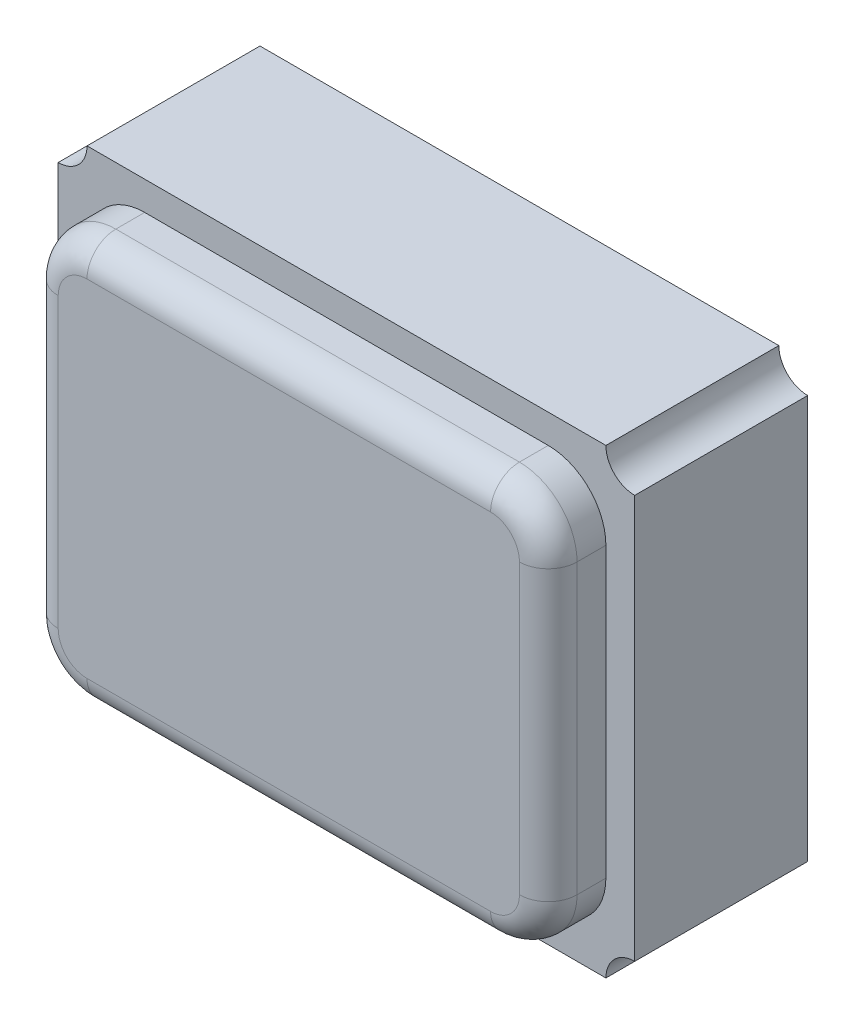
ISO-10303-21;
HEADER;
FILE_DESCRIPTION(('STEP AP214'),'2;1');
FILE_NAME('part.step','',(''),(''),'','','');
FILE_SCHEMA(('AUTOMOTIVE_DESIGN { 1 0 10303 214 1 1 1 1 }'));
ENDSEC;
DATA;
#1=APPLICATION_CONTEXT('core data for automotive mechanical design processes');
#2=APPLICATION_PROTOCOL_DEFINITION('international standard','automotive_design',2000,#1);
#3=PRODUCT_CONTEXT('',#1,'mechanical');
#4=PRODUCT('Part','Part','',(#3));
#5=PRODUCT_RELATED_PRODUCT_CATEGORY('part','',(#4));
#6=PRODUCT_DEFINITION_FORMATION('','',#4);
#7=PRODUCT_DEFINITION_CONTEXT('part definition',#1,'design');
#8=PRODUCT_DEFINITION('design','',#6,#7);
#9=PRODUCT_DEFINITION_SHAPE('','',#8);
#10=(LENGTH_UNIT() NAMED_UNIT(*) SI_UNIT(.MILLI.,.METRE.));
#11=(NAMED_UNIT(*) PLANE_ANGLE_UNIT() SI_UNIT($,.RADIAN.));
#12=(NAMED_UNIT(*) SI_UNIT($,.STERADIAN.) SOLID_ANGLE_UNIT());
#13=UNCERTAINTY_MEASURE_WITH_UNIT(LENGTH_MEASURE(1.E-05),#10,'distance_accuracy_value','');
#14=(GEOMETRIC_REPRESENTATION_CONTEXT(3) GLOBAL_UNCERTAINTY_ASSIGNED_CONTEXT((#13)) GLOBAL_UNIT_ASSIGNED_CONTEXT((#10,
#11,#12)) REPRESENTATION_CONTEXT('',''));
#15=CARTESIAN_POINT('',(0.,0.,0.));
#16=DIRECTION('',(0.,0.,1.));
#17=DIRECTION('',(1.,0.,0.));
#18=AXIS2_PLACEMENT_3D('',#15,#16,#17);
#19=CARTESIAN_POINT('',(3.,0.,3.227777777778));
#20=DIRECTION('',(0.,0.,1.));
#21=DIRECTION('',(1.,0.,0.));
#22=AXIS2_PLACEMENT_3D('',#19,#20,#21);
#23=PLANE('',#22);
#24=DIRECTION('',(0.,-1.,0.));
#25=VECTOR('',#24,1.);
#26=CARTESIAN_POINT('',(2.2,0.,3.227777777778));
#27=LINE('',#26,#25);
#28=CARTESIAN_POINT('',(2.2,-0.5,3.227777777778));
#29=VERTEX_POINT('',#28);
#30=CARTESIAN_POINT('',(2.2,0.5,3.227777777778));
#31=VERTEX_POINT('',#30);
#32=EDGE_CURVE('E178',#29,#31,#27,.F.);
#33=ORIENTED_EDGE('',*,*,#32,.F.);
#34=CARTESIAN_POINT('',(2.3,-0.5,3.227777777778));
#35=DIRECTION('',(0.,0.,-1.));
#36=DIRECTION('',(0.,-1.,0.));
#37=AXIS2_PLACEMENT_3D('',#34,#35,#36);
#38=CIRCLE('',#37,0.0999999999999998);
#39=CARTESIAN_POINT('',(2.3,-0.6,3.227777777778));
#40=VERTEX_POINT('',#39);
#41=EDGE_CURVE('E161',#40,#29,#38,.T.);
#42=ORIENTED_EDGE('',*,*,#41,.F.);
#43=DIRECTION('',(1.,0.,0.));
#44=VECTOR('',#43,1.);
#45=CARTESIAN_POINT('',(3.,-0.6,3.227777777778));
#46=LINE('',#45,#44);
#47=CARTESIAN_POINT('',(3.7,-0.6,3.227777777778));
#48=VERTEX_POINT('',#47);
#49=EDGE_CURVE('E221',#48,#40,#46,.F.);
#50=ORIENTED_EDGE('',*,*,#49,.F.);
#51=CARTESIAN_POINT('',(3.7,-0.5,3.227777777778));
#52=DIRECTION('',(0.,0.,-1.));
#53=DIRECTION('',(1.,0.,0.));
#54=AXIS2_PLACEMENT_3D('',#51,#52,#53);
#55=CIRCLE('',#54,0.0999999999999998);
#56=CARTESIAN_POINT('',(3.8,-0.5,3.227777777778));
#57=VERTEX_POINT('',#56);
#58=EDGE_CURVE('E334',#57,#48,#55,.T.);
#59=ORIENTED_EDGE('',*,*,#58,.F.);
#60=DIRECTION('',(0.,1.,0.));
#61=VECTOR('',#60,1.);
#62=CARTESIAN_POINT('',(3.8,0.,3.227777777778));
#63=LINE('',#62,#61);
#64=CARTESIAN_POINT('',(3.8,0.5,3.227777777778));
#65=VERTEX_POINT('',#64);
#66=EDGE_CURVE('E363',#65,#57,#63,.F.);
#67=ORIENTED_EDGE('',*,*,#66,.F.);
#68=CARTESIAN_POINT('',(3.7,0.5,3.227777777778));
#69=DIRECTION('',(0.,0.,-1.));
#70=DIRECTION('',(0.,1.,0.));
#71=AXIS2_PLACEMENT_3D('',#68,#69,#70);
#72=CIRCLE('',#71,0.0999999999999998);
#73=CARTESIAN_POINT('',(3.7,0.6,3.227777777778));
#74=VERTEX_POINT('',#73);
#75=EDGE_CURVE('E378',#74,#65,#72,.T.);
#76=ORIENTED_EDGE('',*,*,#75,.F.);
#77=DIRECTION('',(-1.,0.,0.));
#78=VECTOR('',#77,1.);
#79=CARTESIAN_POINT('',(3.,0.6,3.227777777778));
#80=LINE('',#79,#78);
#81=CARTESIAN_POINT('',(2.3,0.6,3.227777777778));
#82=VERTEX_POINT('',#81);
#83=EDGE_CURVE('E383',#82,#74,#80,.F.);
#84=ORIENTED_EDGE('',*,*,#83,.F.);
#85=CARTESIAN_POINT('',(2.3,0.5,3.227777777778));
#86=DIRECTION('',(0.,0.,-1.));
#87=DIRECTION('',(-1.,0.,0.));
#88=AXIS2_PLACEMENT_3D('',#85,#86,#87);
#89=CIRCLE('',#88,0.0999999999999998);
#90=EDGE_CURVE('E184',#31,#82,#89,.T.);
#91=ORIENTED_EDGE('',*,*,#90,.F.);
#92=EDGE_LOOP('',(#33,#42,#50,#59,#67,#76,#84,#91));
#93=FACE_BOUND('',#92,.T.);
#94=ADVANCED_FACE('F17',(#93),#23,.T.);
#95=CARTESIAN_POINT('',(2.2,-0.5,3.127777777778));
#96=DIRECTION('',(0.,1.,0.));
#97=DIRECTION('',(-1.,0.,0.));
#98=AXIS2_PLACEMENT_3D('',#95,#96,#97);
#99=CIRCLE('',#98,0.1);
#100=TRIMMED_CURVE('',#99,(PARAMETER_VALUE(-3.14159265358979)),
(PARAMETER_VALUE(3.14159265358979)),.T.,.PARAMETER.);
#101=CARTESIAN_POINT('',(2.3,-0.5,3.127777777778));
#102=DIRECTION('',(0.,0.,-1.));
#103=AXIS1_PLACEMENT('',#101,#102);
#104=SURFACE_OF_REVOLUTION('',#100,#103);
#105=CARTESIAN_POINT('',(2.3,-0.6,3.127777777778));
#106=DIRECTION('',(1.,0.,0.));
#107=DIRECTION('',(0.,0.,-1.));
#108=AXIS2_PLACEMENT_3D('',#105,#106,#107);
#109=CIRCLE('',#108,0.1);
#110=CARTESIAN_POINT('',(2.3,-0.7,3.127777777778));
#111=VERTEX_POINT('',#110);
#112=EDGE_CURVE('E116',#40,#111,#109,.T.);
#113=ORIENTED_EDGE('',*,*,#112,.F.);
#114=ORIENTED_EDGE('',*,*,#41,.T.);
#115=CARTESIAN_POINT('',(2.2,-0.5,3.127777777778));
#116=DIRECTION('',(0.,-1.,0.));
#117=DIRECTION('',(0.,0.,-1.));
#118=AXIS2_PLACEMENT_3D('',#115,#116,#117);
#119=CIRCLE('',#118,0.1);
#120=CARTESIAN_POINT('',(2.1,-0.5,3.127777777778));
#121=VERTEX_POINT('',#120);
#122=EDGE_CURVE('E166',#121,#29,#119,.F.);
#123=ORIENTED_EDGE('',*,*,#122,.F.);
#124=CARTESIAN_POINT('',(2.3,-0.5,3.127777777778));
#125=DIRECTION('',(0.,0.,-1.));
#126=DIRECTION('',(-1.,0.,0.));
#127=AXIS2_PLACEMENT_3D('',#124,#125,#126);
#128=CIRCLE('',#127,0.2);
#129=EDGE_CURVE('E327',#111,#121,#128,.T.);
#130=ORIENTED_EDGE('',*,*,#129,.F.);
#131=EDGE_LOOP('',(#113,#114,#123,#130));
#132=FACE_BOUND('',#131,.T.);
#133=ADVANCED_FACE('F164',(#132),#104,.F.);
#134=CARTESIAN_POINT('',(2.2,0.,3.127777777778));
#135=DIRECTION('',(0.,-1.,0.));
#136=DIRECTION('',(0.,0.,-1.));
#137=AXIS2_PLACEMENT_3D('',#134,#135,#136);
#138=CYLINDRICAL_SURFACE('',#137,0.1);
#139=ORIENTED_EDGE('',*,*,#122,.T.);
#140=ORIENTED_EDGE('',*,*,#32,.T.);
#141=CARTESIAN_POINT('',(2.2,0.5,3.127777777778));
#142=DIRECTION('',(0.,1.,0.));
#143=DIRECTION('',(-1.,0.,0.));
#144=AXIS2_PLACEMENT_3D('',#141,#142,#143);
#145=CIRCLE('',#144,0.1);
#146=CARTESIAN_POINT('',(2.1,0.5,3.127777777778));
#147=VERTEX_POINT('',#146);
#148=EDGE_CURVE('E186',#147,#31,#145,.T.);
#149=ORIENTED_EDGE('',*,*,#148,.F.);
#150=DIRECTION('',(0.,1.,0.));
#151=VECTOR('',#150,1.);
#152=CARTESIAN_POINT('',(2.1,0.,3.127777777778));
#153=LINE('',#152,#151);
#154=EDGE_CURVE('E180',#121,#147,#153,.T.);
#155=ORIENTED_EDGE('',*,*,#154,.F.);
#156=EDGE_LOOP('',(#139,#140,#149,#155));
#157=FACE_BOUND('',#156,.T.);
#158=ADVANCED_FACE('F176',(#157),#138,.T.);
#159=CARTESIAN_POINT('',(2.2,0.5,3.127777777778));
#160=DIRECTION('',(0.,1.,0.));
#161=DIRECTION('',(-1.,0.,0.));
#162=AXIS2_PLACEMENT_3D('',#159,#160,#161);
#163=CIRCLE('',#162,0.1);
#164=TRIMMED_CURVE('',#163,(PARAMETER_VALUE(-3.14159265358979)),
(PARAMETER_VALUE(3.14159265358979)),.T.,.PARAMETER.);
#165=CARTESIAN_POINT('',(2.3,0.5,3.127777777778));
#166=DIRECTION('',(0.,0.,-1.));
#167=AXIS1_PLACEMENT('',#165,#166);
#168=SURFACE_OF_REVOLUTION('',#164,#167);
#169=ORIENTED_EDGE('',*,*,#148,.T.);
#170=ORIENTED_EDGE('',*,*,#90,.T.);
#171=CARTESIAN_POINT('',(2.3,0.6,3.127777777778));
#172=DIRECTION('',(-1.,0.,0.));
#173=DIRECTION('',(0.,0.,1.));
#174=AXIS2_PLACEMENT_3D('',#171,#172,#173);
#175=CIRCLE('',#174,0.1);
#176=CARTESIAN_POINT('',(2.3,0.7,3.127777777778));
#177=VERTEX_POINT('',#176);
#178=EDGE_CURVE('E405',#177,#82,#175,.F.);
#179=ORIENTED_EDGE('',*,*,#178,.F.);
#180=CARTESIAN_POINT('',(2.3,0.5,3.127777777778));
#181=DIRECTION('',(0.,0.,-1.));
#182=DIRECTION('',(-1.,0.,0.));
#183=AXIS2_PLACEMENT_3D('',#180,#181,#182);
#184=CIRCLE('',#183,0.2);
#185=EDGE_CURVE('E314',#147,#177,#184,.T.);
#186=ORIENTED_EDGE('',*,*,#185,.F.);
#187=EDGE_LOOP('',(#169,#170,#179,#186));
#188=FACE_BOUND('',#187,.T.);
#189=ADVANCED_FACE('F196',(#188),#168,.F.);
#190=CARTESIAN_POINT('',(3.,0.6,3.127777777778));
#191=DIRECTION('',(-1.,0.,0.));
#192=DIRECTION('',(0.,0.,1.));
#193=AXIS2_PLACEMENT_3D('',#190,#191,#192);
#194=CYLINDRICAL_SURFACE('',#193,0.1);
#195=ORIENTED_EDGE('',*,*,#178,.T.);
#196=ORIENTED_EDGE('',*,*,#83,.T.);
#197=CARTESIAN_POINT('',(3.7,0.599999999999999,3.127777777778));
#198=DIRECTION('',(1.,0.,0.));
#199=DIRECTION('',(0.,1.,0.));
#200=AXIS2_PLACEMENT_3D('',#197,#198,#199);
#201=CIRCLE('',#200,0.1);
#202=CARTESIAN_POINT('',(3.7,0.7,3.127777777778));
#203=VERTEX_POINT('',#202);
#204=EDGE_CURVE('E398',#203,#74,#201,.T.);
#205=ORIENTED_EDGE('',*,*,#204,.F.);
#206=DIRECTION('',(1.,0.,0.));
#207=VECTOR('',#206,1.);
#208=CARTESIAN_POINT('',(3.,0.7,3.127777777778));
#209=LINE('',#208,#207);
#210=EDGE_CURVE('E308',#177,#203,#209,.T.);
#211=ORIENTED_EDGE('',*,*,#210,.F.);
#212=EDGE_LOOP('',(#195,#196,#205,#211));
#213=FACE_BOUND('',#212,.T.);
#214=ADVANCED_FACE('F207',(#213),#194,.T.);
#215=CARTESIAN_POINT('',(3.6,0.5,3.127777777778));
#216=DIRECTION('',(0.,1.,0.));
#217=DIRECTION('',(-1.,0.,0.));
#218=AXIS2_PLACEMENT_3D('',#215,#216,#217);
#219=CIRCLE('',#218,0.1);
#220=TRIMMED_CURVE('',#219,(PARAMETER_VALUE(-3.14159265358979)),
(PARAMETER_VALUE(3.14159265358979)),.T.,.PARAMETER.);
#221=CARTESIAN_POINT('',(3.7,0.5,3.127777777778));
#222=DIRECTION('',(0.,0.,-1.));
#223=AXIS1_PLACEMENT('',#221,#222);
#224=SURFACE_OF_REVOLUTION('',#220,#223);
#225=CARTESIAN_POINT('',(3.8,0.5,3.127777777778));
#226=DIRECTION('',(0.,1.,0.));
#227=DIRECTION('',(0.,0.,1.));
#228=AXIS2_PLACEMENT_3D('',#225,#226,#227);
#229=CIRCLE('',#228,0.1);
#230=CARTESIAN_POINT('',(3.9,0.5,3.127777777778));
#231=VERTEX_POINT('',#230);
#232=EDGE_CURVE('E370',#231,#65,#229,.F.);
#233=ORIENTED_EDGE('',*,*,#232,.F.);
#234=CARTESIAN_POINT('',(3.7,0.5,3.127777777778));
#235=DIRECTION('',(0.,0.,-1.));
#236=DIRECTION('',(-1.,0.,0.));
#237=AXIS2_PLACEMENT_3D('',#234,#235,#236);
#238=CIRCLE('',#237,0.2);
#239=EDGE_CURVE('E302',#203,#231,#238,.T.);
#240=ORIENTED_EDGE('',*,*,#239,.F.);
#241=ORIENTED_EDGE('',*,*,#204,.T.);
#242=ORIENTED_EDGE('',*,*,#75,.T.);
#243=EDGE_LOOP('',(#233,#240,#241,#242));
#244=FACE_BOUND('',#243,.T.);
#245=ADVANCED_FACE('F384',(#244),#224,.F.);
#246=CARTESIAN_POINT('',(3.8,0.,3.127777777778));
#247=DIRECTION('',(0.,1.,0.));
#248=DIRECTION('',(0.,0.,1.));
#249=AXIS2_PLACEMENT_3D('',#246,#247,#248);
#250=CYLINDRICAL_SURFACE('',#249,0.1);
#251=CARTESIAN_POINT('',(3.8,-0.5,3.127777777778));
#252=DIRECTION('',(0.,-1.,0.));
#253=DIRECTION('',(1.,0.,0.));
#254=AXIS2_PLACEMENT_3D('',#251,#252,#253);
#255=CIRCLE('',#254,0.1);
#256=CARTESIAN_POINT('',(3.9,-0.5,3.127777777778));
#257=VERTEX_POINT('',#256);
#258=EDGE_CURVE('E345',#257,#57,#255,.T.);
#259=ORIENTED_EDGE('',*,*,#258,.F.);
#260=DIRECTION('',(0.,1.,0.));
#261=VECTOR('',#260,1.);
#262=CARTESIAN_POINT('',(3.9,0.,3.127777777778));
#263=LINE('',#262,#261);
#264=EDGE_CURVE('E296',#231,#257,#263,.F.);
#265=ORIENTED_EDGE('',*,*,#264,.F.);
#266=ORIENTED_EDGE('',*,*,#232,.T.);
#267=ORIENTED_EDGE('',*,*,#66,.T.);
#268=EDGE_LOOP('',(#259,#265,#266,#267));
#269=FACE_BOUND('',#268,.T.);
#270=ADVANCED_FACE('F354',(#269),#250,.T.);
#271=CARTESIAN_POINT('',(3.6,-0.5,3.127777777778));
#272=DIRECTION('',(0.,1.,0.));
#273=DIRECTION('',(-1.,0.,0.));
#274=AXIS2_PLACEMENT_3D('',#271,#272,#273);
#275=CIRCLE('',#274,0.1);
#276=TRIMMED_CURVE('',#275,(PARAMETER_VALUE(-3.14159265358979)),
(PARAMETER_VALUE(3.14159265358979)),.T.,.PARAMETER.);
#277=CARTESIAN_POINT('',(3.7,-0.5,3.127777777778));
#278=DIRECTION('',(0.,0.,-1.));
#279=AXIS1_PLACEMENT('',#277,#278);
#280=SURFACE_OF_REVOLUTION('',#276,#279);
#281=CARTESIAN_POINT('',(3.7,-0.6,3.127777777778));
#282=DIRECTION('',(1.,0.,0.));
#283=DIRECTION('',(0.,0.,-1.));
#284=AXIS2_PLACEMENT_3D('',#281,#282,#283);
#285=CIRCLE('',#284,0.1);
#286=CARTESIAN_POINT('',(3.7,-0.7,3.127777777778));
#287=VERTEX_POINT('',#286);
#288=EDGE_CURVE('E331',#287,#48,#285,.F.);
#289=ORIENTED_EDGE('',*,*,#288,.F.);
#290=CARTESIAN_POINT('',(3.7,-0.5,3.127777777778));
#291=DIRECTION('',(0.,0.,-1.));
#292=DIRECTION('',(-1.,0.,0.));
#293=AXIS2_PLACEMENT_3D('',#290,#291,#292);
#294=CIRCLE('',#293,0.2);
#295=EDGE_CURVE('E290',#257,#287,#294,.T.);
#296=ORIENTED_EDGE('',*,*,#295,.F.);
#297=ORIENTED_EDGE('',*,*,#258,.T.);
#298=ORIENTED_EDGE('',*,*,#58,.T.);
#299=EDGE_LOOP('',(#289,#296,#297,#298));
#300=FACE_BOUND('',#299,.T.);
#301=ADVANCED_FACE('F348',(#300),#280,.F.);
#302=CARTESIAN_POINT('',(3.,-0.6,3.127777777778));
#303=DIRECTION('',(1.,0.,0.));
#304=DIRECTION('',(0.,0.,-1.));
#305=AXIS2_PLACEMENT_3D('',#302,#303,#304);
#306=CYLINDRICAL_SURFACE('',#305,0.1);
#307=ORIENTED_EDGE('',*,*,#112,.T.);
#308=DIRECTION('',(1.,0.,0.));
#309=VECTOR('',#308,1.);
#310=CARTESIAN_POINT('',(3.,-0.7,3.127777777778));
#311=LINE('',#310,#309);
#312=EDGE_CURVE('E278',#287,#111,#311,.F.);
#313=ORIENTED_EDGE('',*,*,#312,.F.);
#314=ORIENTED_EDGE('',*,*,#288,.T.);
#315=ORIENTED_EDGE('',*,*,#49,.T.);
#316=EDGE_LOOP('',(#307,#313,#314,#315));
#317=FACE_BOUND('',#316,.T.);
#318=ADVANCED_FACE('F353',(#317),#306,.T.);
#319=CARTESIAN_POINT('',(2.3,-0.5,3.027777777778));
#320=DIRECTION('',(0.,0.,-1.));
#321=DIRECTION('',(-1.,0.,0.));
#322=AXIS2_PLACEMENT_3D('',#319,#320,#321);
#323=CYLINDRICAL_SURFACE('',#322,0.2);
#324=CARTESIAN_POINT('',(2.3,-0.5,3.027777777778));
#325=DIRECTION('',(0.,0.,-1.));
#326=DIRECTION('',(-1.,0.,0.));
#327=AXIS2_PLACEMENT_3D('',#324,#325,#326);
#328=CIRCLE('',#327,0.2);
#329=CARTESIAN_POINT('',(2.3,-0.7,3.027777777778));
#330=VERTEX_POINT('',#329);
#331=CARTESIAN_POINT('',(2.1,-0.5,3.027777777778));
#332=VERTEX_POINT('',#331);
#333=EDGE_CURVE('E264',#330,#332,#328,.T.);
#334=ORIENTED_EDGE('',*,*,#333,.F.);
#335=DIRECTION('',(0.,0.,-1.));
#336=VECTOR('',#335,1.);
#337=CARTESIAN_POINT('',(2.3,-0.7,3.027777777778));
#338=LINE('',#337,#336);
#339=EDGE_CURVE('E273',#111,#330,#338,.T.);
#340=ORIENTED_EDGE('',*,*,#339,.F.);
#341=ORIENTED_EDGE('',*,*,#129,.T.);
#342=DIRECTION('',(0.,0.,1.));
#343=VECTOR('',#342,1.);
#344=CARTESIAN_POINT('',(2.1,-0.5,3.027777777778));
#345=LINE('',#344,#343);
#346=EDGE_CURVE('E317',#332,#121,#345,.T.);
#347=ORIENTED_EDGE('',*,*,#346,.F.);
#348=EDGE_LOOP('',(#334,#340,#341,#347));
#349=FACE_BOUND('',#348,.T.);
#350=ADVANCED_FACE('F493',(#349),#323,.T.);
#351=CARTESIAN_POINT('',(2.1,0.,3.027777777778));
#352=DIRECTION('',(-1.,0.,0.));
#353=DIRECTION('',(0.,0.,1.));
#354=AXIS2_PLACEMENT_3D('',#351,#352,#353);
#355=PLANE('',#354);
#356=DIRECTION('',(0.,1.,0.));
#357=VECTOR('',#356,1.);
#358=CARTESIAN_POINT('',(2.1,0.,3.027777777778));
#359=LINE('',#358,#357);
#360=CARTESIAN_POINT('',(2.1,0.5,3.027777777778));
#361=VERTEX_POINT('',#360);
#362=EDGE_CURVE('E263',#332,#361,#359,.T.);
#363=ORIENTED_EDGE('',*,*,#362,.F.);
#364=ORIENTED_EDGE('',*,*,#346,.T.);
#365=ORIENTED_EDGE('',*,*,#154,.T.);
#366=DIRECTION('',(0.,0.,-1.));
#367=VECTOR('',#366,1.);
#368=CARTESIAN_POINT('',(2.1,0.5,3.027777777778));
#369=LINE('',#368,#367);
#370=EDGE_CURVE('E311',#361,#147,#369,.F.);
#371=ORIENTED_EDGE('',*,*,#370,.F.);
#372=EDGE_LOOP('',(#363,#364,#365,#371));
#373=FACE_BOUND('',#372,.T.);
#374=ADVANCED_FACE('F412',(#373),#355,.T.);
#375=CARTESIAN_POINT('',(2.3,0.5,3.027777777778));
#376=DIRECTION('',(0.,0.,-1.));
#377=DIRECTION('',(-1.,0.,0.));
#378=AXIS2_PLACEMENT_3D('',#375,#376,#377);
#379=CYLINDRICAL_SURFACE('',#378,0.2);
#380=CARTESIAN_POINT('',(2.3,0.5,3.027777777778));
#381=DIRECTION('',(0.,0.,-1.));
#382=DIRECTION('',(-1.,0.,0.));
#383=AXIS2_PLACEMENT_3D('',#380,#381,#382);
#384=CIRCLE('',#383,0.2);
#385=CARTESIAN_POINT('',(2.3,0.7,3.027777777778));
#386=VERTEX_POINT('',#385);
#387=EDGE_CURVE('E261',#361,#386,#384,.T.);
#388=ORIENTED_EDGE('',*,*,#387,.F.);
#389=ORIENTED_EDGE('',*,*,#370,.T.);
#390=ORIENTED_EDGE('',*,*,#185,.T.);
#391=DIRECTION('',(0.,0.,1.));
#392=VECTOR('',#391,1.);
#393=CARTESIAN_POINT('',(2.3,0.7,3.027777777778));
#394=LINE('',#393,#392);
#395=EDGE_CURVE('E305',#386,#177,#394,.T.);
#396=ORIENTED_EDGE('',*,*,#395,.F.);
#397=EDGE_LOOP('',(#388,#389,#390,#396));
#398=FACE_BOUND('',#397,.T.);
#399=ADVANCED_FACE('F417',(#398),#379,.T.);
#400=CARTESIAN_POINT('',(3.,0.7,3.027777777778));
#401=DIRECTION('',(0.,1.,0.));
#402=DIRECTION('',(0.,0.,1.));
#403=AXIS2_PLACEMENT_3D('',#400,#401,#402);
#404=PLANE('',#403);
#405=DIRECTION('',(1.,0.,0.));
#406=VECTOR('',#405,1.);
#407=CARTESIAN_POINT('',(3.,0.7,3.027777777778));
#408=LINE('',#407,#406);
#409=CARTESIAN_POINT('',(3.7,0.7,3.027777777778));
#410=VERTEX_POINT('',#409);
#411=EDGE_CURVE('E260',#386,#410,#408,.T.);
#412=ORIENTED_EDGE('',*,*,#411,.F.);
#413=ORIENTED_EDGE('',*,*,#395,.T.);
#414=ORIENTED_EDGE('',*,*,#210,.T.);
#415=DIRECTION('',(0.,0.,-1.));
#416=VECTOR('',#415,1.);
#417=CARTESIAN_POINT('',(3.7,0.7,3.027777777778));
#418=LINE('',#417,#416);
#419=EDGE_CURVE('E299',#410,#203,#418,.F.);
#420=ORIENTED_EDGE('',*,*,#419,.F.);
#421=EDGE_LOOP('',(#412,#413,#414,#420));
#422=FACE_BOUND('',#421,.T.);
#423=ADVANCED_FACE('F424',(#422),#404,.T.);
#424=CARTESIAN_POINT('',(3.7,0.5,3.027777777778));
#425=DIRECTION('',(0.,0.,-1.));
#426=DIRECTION('',(-1.,0.,0.));
#427=AXIS2_PLACEMENT_3D('',#424,#425,#426);
#428=CYLINDRICAL_SURFACE('',#427,0.2);
#429=CARTESIAN_POINT('',(3.7,0.5,3.027777777778));
#430=DIRECTION('',(0.,0.,-1.));
#431=DIRECTION('',(-1.,0.,0.));
#432=AXIS2_PLACEMENT_3D('',#429,#430,#431);
#433=CIRCLE('',#432,0.2);
#434=CARTESIAN_POINT('',(3.9,0.5,3.027777777778));
#435=VERTEX_POINT('',#434);
#436=EDGE_CURVE('E258',#410,#435,#433,.T.);
#437=ORIENTED_EDGE('',*,*,#436,.F.);
#438=ORIENTED_EDGE('',*,*,#419,.T.);
#439=ORIENTED_EDGE('',*,*,#239,.T.);
#440=DIRECTION('',(0.,0.,-1.));
#441=VECTOR('',#440,1.);
#442=CARTESIAN_POINT('',(3.9,0.5,3.027777777778));
#443=LINE('',#442,#441);
#444=EDGE_CURVE('E293',#435,#231,#443,.F.);
#445=ORIENTED_EDGE('',*,*,#444,.F.);
#446=EDGE_LOOP('',(#437,#438,#439,#445));
#447=FACE_BOUND('',#446,.T.);
#448=ADVANCED_FACE('F438',(#447),#428,.T.);
#449=CARTESIAN_POINT('',(3.9,0.,3.027777777778));
#450=DIRECTION('',(1.,0.,0.));
#451=DIRECTION('',(0.,0.,-1.));
#452=AXIS2_PLACEMENT_3D('',#449,#450,#451);
#453=PLANE('',#452);
#454=DIRECTION('',(0.,1.,0.));
#455=VECTOR('',#454,1.);
#456=CARTESIAN_POINT('',(3.9,0.,3.027777777778));
#457=LINE('',#456,#455);
#458=CARTESIAN_POINT('',(3.9,-0.5,3.027777777778));
#459=VERTEX_POINT('',#458);
#460=EDGE_CURVE('E257',#435,#459,#457,.F.);
#461=ORIENTED_EDGE('',*,*,#460,.F.);
#462=ORIENTED_EDGE('',*,*,#444,.T.);
#463=ORIENTED_EDGE('',*,*,#264,.T.);
#464=DIRECTION('',(0.,0.,-1.));
#465=VECTOR('',#464,1.);
#466=CARTESIAN_POINT('',(3.9,-0.5,3.027777777778));
#467=LINE('',#466,#465);
#468=EDGE_CURVE('E287',#459,#257,#467,.F.);
#469=ORIENTED_EDGE('',*,*,#468,.F.);
#470=EDGE_LOOP('',(#461,#462,#463,#469));
#471=FACE_BOUND('',#470,.T.);
#472=ADVANCED_FACE('F444',(#471),#453,.T.);
#473=CARTESIAN_POINT('',(3.7,-0.5,3.027777777778));
#474=DIRECTION('',(0.,0.,-1.));
#475=DIRECTION('',(-1.,0.,0.));
#476=AXIS2_PLACEMENT_3D('',#473,#474,#475);
#477=CYLINDRICAL_SURFACE('',#476,0.2);
#478=CARTESIAN_POINT('',(3.7,-0.5,3.027777777778));
#479=DIRECTION('',(0.,0.,-1.));
#480=DIRECTION('',(-1.,0.,0.));
#481=AXIS2_PLACEMENT_3D('',#478,#479,#480);
#482=CIRCLE('',#481,0.2);
#483=CARTESIAN_POINT('',(3.7,-0.7,3.027777777778));
#484=VERTEX_POINT('',#483);
#485=EDGE_CURVE('E254',#459,#484,#482,.T.);
#486=ORIENTED_EDGE('',*,*,#485,.F.);
#487=ORIENTED_EDGE('',*,*,#468,.T.);
#488=ORIENTED_EDGE('',*,*,#295,.T.);
#489=DIRECTION('',(0.,0.,-1.));
#490=VECTOR('',#489,1.);
#491=CARTESIAN_POINT('',(3.7,-0.7,3.027777777778));
#492=LINE('',#491,#490);
#493=EDGE_CURVE('E269',#484,#287,#492,.F.);
#494=ORIENTED_EDGE('',*,*,#493,.F.);
#495=EDGE_LOOP('',(#486,#487,#488,#494));
#496=FACE_BOUND('',#495,.T.);
#497=ADVANCED_FACE('F452',(#496),#477,.T.);
#498=CARTESIAN_POINT('',(3.,-0.7,3.027777777778));
#499=DIRECTION('',(0.,-1.,0.));
#500=DIRECTION('',(0.,0.,-1.));
#501=AXIS2_PLACEMENT_3D('',#498,#499,#500);
#502=PLANE('',#501);
#503=DIRECTION('',(1.,0.,0.));
#504=VECTOR('',#503,1.);
#505=CARTESIAN_POINT('',(3.,-0.7,3.027777777778));
#506=LINE('',#505,#504);
#507=EDGE_CURVE('E256',#484,#330,#506,.F.);
#508=ORIENTED_EDGE('',*,*,#507,.F.);
#509=ORIENTED_EDGE('',*,*,#493,.T.);
#510=ORIENTED_EDGE('',*,*,#312,.T.);
#511=ORIENTED_EDGE('',*,*,#339,.T.);
#512=EDGE_LOOP('',(#508,#509,#510,#511));
#513=FACE_BOUND('',#512,.T.);
#514=ADVANCED_FACE('F488',(#513),#502,.T.);
#515=CARTESIAN_POINT('',(3.,0.,3.027777777778));
#516=DIRECTION('',(0.,0.,1.));
#517=DIRECTION('',(1.,0.,0.));
#518=AXIS2_PLACEMENT_3D('',#515,#516,#517);
#519=PLANE('',#518);
#520=ORIENTED_EDGE('',*,*,#485,.T.);
#521=ORIENTED_EDGE('',*,*,#507,.T.);
#522=ORIENTED_EDGE('',*,*,#333,.T.);
#523=ORIENTED_EDGE('',*,*,#362,.T.);
#524=ORIENTED_EDGE('',*,*,#387,.T.);
#525=ORIENTED_EDGE('',*,*,#411,.T.);
#526=ORIENTED_EDGE('',*,*,#436,.T.);
#527=ORIENTED_EDGE('',*,*,#460,.T.);
#528=EDGE_LOOP('',(#520,#521,#522,#523,#524,#525,#526,#527));
#529=FACE_BOUND('',#528,.T.);
#530=CARTESIAN_POINT('',(2.,0.8,3.027777777778));
#531=DIRECTION('',(0.,0.,1.));
#532=DIRECTION('',(0.,-1.,0.));
#533=AXIS2_PLACEMENT_3D('',#530,#531,#532);
#534=CIRCLE('',#533,0.1);
#535=CARTESIAN_POINT('',(2.1,0.800000000000001,3.027777777778));
#536=VERTEX_POINT('',#535);
#537=CARTESIAN_POINT('',(2.,0.7,3.027777777778));
#538=VERTEX_POINT('',#537);
#539=EDGE_CURVE('E265',#536,#538,#534,.F.);
#540=ORIENTED_EDGE('',*,*,#539,.T.);
#541=DIRECTION('',(0.,1.,0.));
#542=VECTOR('',#541,1.);
#543=CARTESIAN_POINT('',(2.,0.,3.027777777778));
#544=LINE('',#543,#542);
#545=CARTESIAN_POINT('',(2.,-0.7,3.027777777778));
#546=VERTEX_POINT('',#545);
#547=EDGE_CURVE('E108',#538,#546,#544,.F.);
#548=ORIENTED_EDGE('',*,*,#547,.T.);
#549=CARTESIAN_POINT('',(2.,-0.8,3.027777777778));
#550=DIRECTION('',(0.,0.,1.));
#551=DIRECTION('',(0.,-1.,0.));
#552=AXIS2_PLACEMENT_3D('',#549,#550,#551);
#553=CIRCLE('',#552,0.1);
#554=CARTESIAN_POINT('',(2.1,-0.8,3.027777777778));
#555=VERTEX_POINT('',#554);
#556=EDGE_CURVE('E21',#546,#555,#553,.F.);
#557=ORIENTED_EDGE('',*,*,#556,.T.);
#558=DIRECTION('',(1.,0.,0.));
#559=VECTOR('',#558,1.);
#560=CARTESIAN_POINT('',(3.,-0.8,3.027777777778));
#561=LINE('',#560,#559);
#562=CARTESIAN_POINT('',(3.9,-0.799999999999999,3.027777777778));
#563=VERTEX_POINT('',#562);
#564=EDGE_CURVE('E253',#563,#555,#561,.F.);
#565=ORIENTED_EDGE('',*,*,#564,.F.);
#566=CARTESIAN_POINT('',(4.,-0.8,3.027777777778));
#567=DIRECTION('',(0.,0.,1.));
#568=DIRECTION('',(0.,-1.,0.));
#569=AXIS2_PLACEMENT_3D('',#566,#567,#568);
#570=CIRCLE('',#569,0.1);
#571=CARTESIAN_POINT('',(4.,-0.7,3.027777777778));
#572=VERTEX_POINT('',#571);
#573=EDGE_CURVE('E250',#563,#572,#570,.F.);
#574=ORIENTED_EDGE('',*,*,#573,.T.);
#575=DIRECTION('',(0.,1.,0.));
#576=VECTOR('',#575,1.);
#577=CARTESIAN_POINT('',(4.,0.,3.027777777778));
#578=LINE('',#577,#576);
#579=CARTESIAN_POINT('',(4.,0.7,3.027777777778));
#580=VERTEX_POINT('',#579);
#581=EDGE_CURVE('E282',#580,#572,#578,.F.);
#582=ORIENTED_EDGE('',*,*,#581,.F.);
#583=CARTESIAN_POINT('',(4.,0.8,3.027777777778));
#584=DIRECTION('',(0.,0.,1.));
#585=DIRECTION('',(0.,-1.,0.));
#586=AXIS2_PLACEMENT_3D('',#583,#584,#585);
#587=CIRCLE('',#586,0.1);
#588=CARTESIAN_POINT('',(3.9,0.8,3.027777777778));
#589=VERTEX_POINT('',#588);
#590=EDGE_CURVE('E245',#580,#589,#587,.F.);
#591=ORIENTED_EDGE('',*,*,#590,.T.);
#592=DIRECTION('',(1.,0.,0.));
#593=VECTOR('',#592,1.);
#594=CARTESIAN_POINT('',(3.,0.8,3.027777777778));
#595=LINE('',#594,#593);
#596=EDGE_CURVE('E248',#536,#589,#595,.T.);
#597=ORIENTED_EDGE('',*,*,#596,.F.);
#598=EDGE_LOOP('',(#540,#548,#557,#565,#574,#582,#591,#597));
#599=FACE_BOUND('',#598,.T.);
#600=ADVANCED_FACE('F495',(#529,#599),#519,.T.);
#601=CARTESIAN_POINT('',(3.,-0.8,2.427777777778));
#602=DIRECTION('',(0.,-1.,0.));
#603=DIRECTION('',(0.,0.,-1.));
#604=AXIS2_PLACEMENT_3D('',#601,#602,#603);
#605=PLANE('',#604);
#606=DIRECTION('',(0.,0.,1.));
#607=VECTOR('',#606,1.);
#608=CARTESIAN_POINT('',(3.9,-0.799999999999998,3.027777777778));
#609=LINE('',#608,#607);
#610=CARTESIAN_POINT('',(3.9,-0.8,2.427777777778));
#611=VERTEX_POINT('',#610);
#612=EDGE_CURVE('E252',#611,#563,#609,.T.);
#613=ORIENTED_EDGE('',*,*,#612,.T.);
#614=ORIENTED_EDGE('',*,*,#564,.T.);
#615=DIRECTION('',(0.,0.,1.));
#616=VECTOR('',#615,1.);
#617=CARTESIAN_POINT('',(2.1,-0.8,3.027777777778));
#618=LINE('',#617,#616);
#619=CARTESIAN_POINT('',(2.1,-0.800000000000001,2.427777777778));
#620=VERTEX_POINT('',#619);
#621=EDGE_CURVE('E517',#555,#620,#618,.F.);
#622=ORIENTED_EDGE('',*,*,#621,.T.);
#623=DIRECTION('',(1.,0.,0.));
#624=VECTOR('',#623,1.);
#625=CARTESIAN_POINT('',(3.,-0.8,2.427777777778));
#626=LINE('',#625,#624);
#627=EDGE_CURVE('E244',#620,#611,#626,.T.);
#628=ORIENTED_EDGE('',*,*,#627,.T.);
#629=EDGE_LOOP('',(#613,#614,#622,#628));
#630=FACE_BOUND('',#629,.T.);
#631=ADVANCED_FACE('F552',(#630),#605,.T.);
#632=CARTESIAN_POINT('',(4.,-0.8,3.027777777778));
#633=DIRECTION('',(0.,0.,1.));
#634=DIRECTION('',(0.,-1.,0.));
#635=AXIS2_PLACEMENT_3D('',#632,#633,#634);
#636=CYLINDRICAL_SURFACE('',#635,0.1);
#637=CARTESIAN_POINT('',(4.,-0.800000000000002,2.427777777778));
#638=DIRECTION('',(0.,0.,1.));
#639=DIRECTION('',(0.,-1.,0.));
#640=AXIS2_PLACEMENT_3D('',#637,#638,#639);
#641=CIRCLE('',#640,0.1);
#642=CARTESIAN_POINT('',(4.,-0.700000000000001,2.427777777778));
#643=VERTEX_POINT('',#642);
#644=EDGE_CURVE('E241',#611,#643,#641,.F.);
#645=ORIENTED_EDGE('',*,*,#644,.T.);
#646=DIRECTION('',(0.,0.,-1.));
#647=VECTOR('',#646,1.);
#648=CARTESIAN_POINT('',(4.,-0.7,2.427777777778));
#649=LINE('',#648,#647);
#650=EDGE_CURVE('E506',#572,#643,#649,.T.);
#651=ORIENTED_EDGE('',*,*,#650,.F.);
#652=ORIENTED_EDGE('',*,*,#573,.F.);
#653=ORIENTED_EDGE('',*,*,#612,.F.);
#654=EDGE_LOOP('',(#645,#651,#652,#653));
#655=FACE_BOUND('',#654,.T.);
#656=ADVANCED_FACE('F550',(#655),#636,.F.);
#657=CARTESIAN_POINT('',(4.,0.,2.427777777778));
#658=DIRECTION('',(1.,0.,0.));
#659=DIRECTION('',(0.,0.,-1.));
#660=AXIS2_PLACEMENT_3D('',#657,#658,#659);
#661=PLANE('',#660);
#662=DIRECTION('',(0.,0.,1.));
#663=VECTOR('',#662,1.);
#664=CARTESIAN_POINT('',(4.,0.7,3.027777777778));
#665=LINE('',#664,#663);
#666=CARTESIAN_POINT('',(4.,0.699999999999998,2.427777777778));
#667=VERTEX_POINT('',#666);
#668=EDGE_CURVE('E249',#667,#580,#665,.T.);
#669=ORIENTED_EDGE('',*,*,#668,.T.);
#670=ORIENTED_EDGE('',*,*,#581,.T.);
#671=ORIENTED_EDGE('',*,*,#650,.T.);
#672=DIRECTION('',(0.,1.,0.));
#673=VECTOR('',#672,1.);
#674=CARTESIAN_POINT('',(4.,0.,2.427777777778));
#675=LINE('',#674,#673);
#676=EDGE_CURVE('E240',#643,#667,#675,.T.);
#677=ORIENTED_EDGE('',*,*,#676,.T.);
#678=EDGE_LOOP('',(#669,#670,#671,#677));
#679=FACE_BOUND('',#678,.T.);
#680=ADVANCED_FACE('F546',(#679),#661,.T.);
#681=CARTESIAN_POINT('',(4.,0.8,3.027777777778));
#682=DIRECTION('',(0.,0.,1.));
#683=DIRECTION('',(0.,-1.,0.));
#684=AXIS2_PLACEMENT_3D('',#681,#682,#683);
#685=CYLINDRICAL_SURFACE('',#684,0.1);
#686=ORIENTED_EDGE('',*,*,#590,.F.);
#687=ORIENTED_EDGE('',*,*,#668,.F.);
#688=CARTESIAN_POINT('',(4.,0.799999999999998,2.427777777778));
#689=DIRECTION('',(0.,0.,1.));
#690=DIRECTION('',(0.,-1.,0.));
#691=AXIS2_PLACEMENT_3D('',#688,#689,#690);
#692=CIRCLE('',#691,0.1);
#693=CARTESIAN_POINT('',(3.9,0.8,2.427777777778));
#694=VERTEX_POINT('',#693);
#695=EDGE_CURVE('E237',#667,#694,#692,.F.);
#696=ORIENTED_EDGE('',*,*,#695,.T.);
#697=DIRECTION('',(0.,0.,1.));
#698=VECTOR('',#697,1.);
#699=CARTESIAN_POINT('',(3.9,0.8,2.427777777778));
#700=LINE('',#699,#698);
#701=EDGE_CURVE('E502',#589,#694,#700,.F.);
#702=ORIENTED_EDGE('',*,*,#701,.F.);
#703=EDGE_LOOP('',(#686,#687,#696,#702));
#704=FACE_BOUND('',#703,.T.);
#705=ADVANCED_FACE('F543',(#704),#685,.F.);
#706=CARTESIAN_POINT('',(3.,0.8,2.427777777778));
#707=DIRECTION('',(0.,1.,0.));
#708=DIRECTION('',(0.,0.,1.));
#709=AXIS2_PLACEMENT_3D('',#706,#707,#708);
#710=PLANE('',#709);
#711=ORIENTED_EDGE('',*,*,#701,.T.);
#712=DIRECTION('',(1.,0.,0.));
#713=VECTOR('',#712,1.);
#714=CARTESIAN_POINT('',(3.,0.8,2.427777777778));
#715=LINE('',#714,#713);
#716=CARTESIAN_POINT('',(2.1,0.8,2.427777777778));
#717=VERTEX_POINT('',#716);
#718=EDGE_CURVE('E236',#694,#717,#715,.F.);
#719=ORIENTED_EDGE('',*,*,#718,.T.);
#720=DIRECTION('',(0.,0.,1.));
#721=VECTOR('',#720,1.);
#722=CARTESIAN_POINT('',(2.1,0.800000000000002,3.027777777778));
#723=LINE('',#722,#721);
#724=EDGE_CURVE('E511',#717,#536,#723,.T.);
#725=ORIENTED_EDGE('',*,*,#724,.T.);
#726=ORIENTED_EDGE('',*,*,#596,.T.);
#727=EDGE_LOOP('',(#711,#719,#725,#726));
#728=FACE_BOUND('',#727,.T.);
#729=ADVANCED_FACE('F537',(#728),#710,.T.);
#730=CARTESIAN_POINT('',(2.,0.8,3.027777777778));
#731=DIRECTION('',(0.,0.,1.));
#732=DIRECTION('',(0.,-1.,0.));
#733=AXIS2_PLACEMENT_3D('',#730,#731,#732);
#734=CYLINDRICAL_SURFACE('',#733,0.1);
#735=ORIENTED_EDGE('',*,*,#539,.F.);
#736=ORIENTED_EDGE('',*,*,#724,.F.);
#737=CARTESIAN_POINT('',(2.,0.799999999999998,2.427777777778));
#738=DIRECTION('',(0.,0.,1.));
#739=DIRECTION('',(0.,-1.,0.));
#740=AXIS2_PLACEMENT_3D('',#737,#738,#739);
#741=CIRCLE('',#740,0.1);
#742=CARTESIAN_POINT('',(2.,0.699999999999999,2.427777777778));
#743=VERTEX_POINT('',#742);
#744=EDGE_CURVE('E233',#717,#743,#741,.F.);
#745=ORIENTED_EDGE('',*,*,#744,.T.);
#746=DIRECTION('',(0.,0.,1.));
#747=VECTOR('',#746,1.);
#748=CARTESIAN_POINT('',(2.,0.7,2.427777777778));
#749=LINE('',#748,#747);
#750=EDGE_CURVE('E514',#538,#743,#749,.F.);
#751=ORIENTED_EDGE('',*,*,#750,.F.);
#752=EDGE_LOOP('',(#735,#736,#745,#751));
#753=FACE_BOUND('',#752,.T.);
#754=ADVANCED_FACE('F535',(#753),#734,.F.);
#755=CARTESIAN_POINT('',(2.,0.,2.427777777778));
#756=DIRECTION('',(-1.,0.,0.));
#757=DIRECTION('',(0.,0.,1.));
#758=AXIS2_PLACEMENT_3D('',#755,#756,#757);
#759=PLANE('',#758);
#760=ORIENTED_EDGE('',*,*,#750,.T.);
#761=DIRECTION('',(0.,1.,0.));
#762=VECTOR('',#761,1.);
#763=CARTESIAN_POINT('',(2.,0.,2.427777777778));
#764=LINE('',#763,#762);
#765=CARTESIAN_POINT('',(2.,-0.700000000000002,2.427777777778));
#766=VERTEX_POINT('',#765);
#767=EDGE_CURVE('E27',#743,#766,#764,.F.);
#768=ORIENTED_EDGE('',*,*,#767,.T.);
#769=DIRECTION('',(0.,0.,1.));
#770=VECTOR('',#769,1.);
#771=CARTESIAN_POINT('',(2.,-0.7,3.027777777778));
#772=LINE('',#771,#770);
#773=EDGE_CURVE('E35',#766,#546,#772,.T.);
#774=ORIENTED_EDGE('',*,*,#773,.T.);
#775=ORIENTED_EDGE('',*,*,#547,.F.);
#776=EDGE_LOOP('',(#760,#768,#774,#775));
#777=FACE_BOUND('',#776,.T.);
#778=ADVANCED_FACE('F529',(#777),#759,.T.);
#779=CARTESIAN_POINT('',(2.,-0.8,3.027777777778));
#780=DIRECTION('',(0.,0.,1.));
#781=DIRECTION('',(0.,-1.,0.));
#782=AXIS2_PLACEMENT_3D('',#779,#780,#781);
#783=CYLINDRICAL_SURFACE('',#782,0.1);
#784=ORIENTED_EDGE('',*,*,#556,.F.);
#785=ORIENTED_EDGE('',*,*,#773,.F.);
#786=CARTESIAN_POINT('',(2.,-0.800000000000002,2.427777777778));
#787=DIRECTION('',(0.,0.,1.));
#788=DIRECTION('',(0.,-1.,0.));
#789=AXIS2_PLACEMENT_3D('',#786,#787,#788);
#790=CIRCLE('',#789,0.1);
#791=EDGE_CURVE('E11',#766,#620,#790,.F.);
#792=ORIENTED_EDGE('',*,*,#791,.T.);
#793=ORIENTED_EDGE('',*,*,#621,.F.);
#794=EDGE_LOOP('',(#784,#785,#792,#793));
#795=FACE_BOUND('',#794,.T.);
#796=ADVANCED_FACE('F554',(#795),#783,.F.);
#797=CARTESIAN_POINT('',(3.,0.,2.427777777778));
#798=DIRECTION('',(0.,0.,1.));
#799=DIRECTION('',(1.,0.,0.));
#800=AXIS2_PLACEMENT_3D('',#797,#798,#799);
#801=PLANE('',#800);
#802=ORIENTED_EDGE('',*,*,#767,.F.);
#803=ORIENTED_EDGE('',*,*,#744,.F.);
#804=ORIENTED_EDGE('',*,*,#718,.F.);
#805=ORIENTED_EDGE('',*,*,#695,.F.);
#806=ORIENTED_EDGE('',*,*,#676,.F.);
#807=ORIENTED_EDGE('',*,*,#644,.F.);
#808=ORIENTED_EDGE('',*,*,#627,.F.);
#809=ORIENTED_EDGE('',*,*,#791,.F.);
#810=EDGE_LOOP('',(#802,#803,#804,#805,#806,#807,#808,#809));
#811=FACE_BOUND('',#810,.T.);
#812=ADVANCED_FACE('F532',(#811),#801,.F.);
#813=CLOSED_SHELL('',(#94,#133,#158,#189,#214,#245,#270,#301,#318,#350,#374,#399,#423,#448,#472,
#497,#514,#600,#631,#656,#680,#705,#729,#754,#778,#796,#812));
#814=MANIFOLD_SOLID_BREP('B1',#813);
#815=ADVANCED_BREP_SHAPE_REPRESENTATION('',(#18,#814),#14);
#816=SHAPE_DEFINITION_REPRESENTATION(#9,#815);
ENDSEC;
END-ISO-10303-21;
